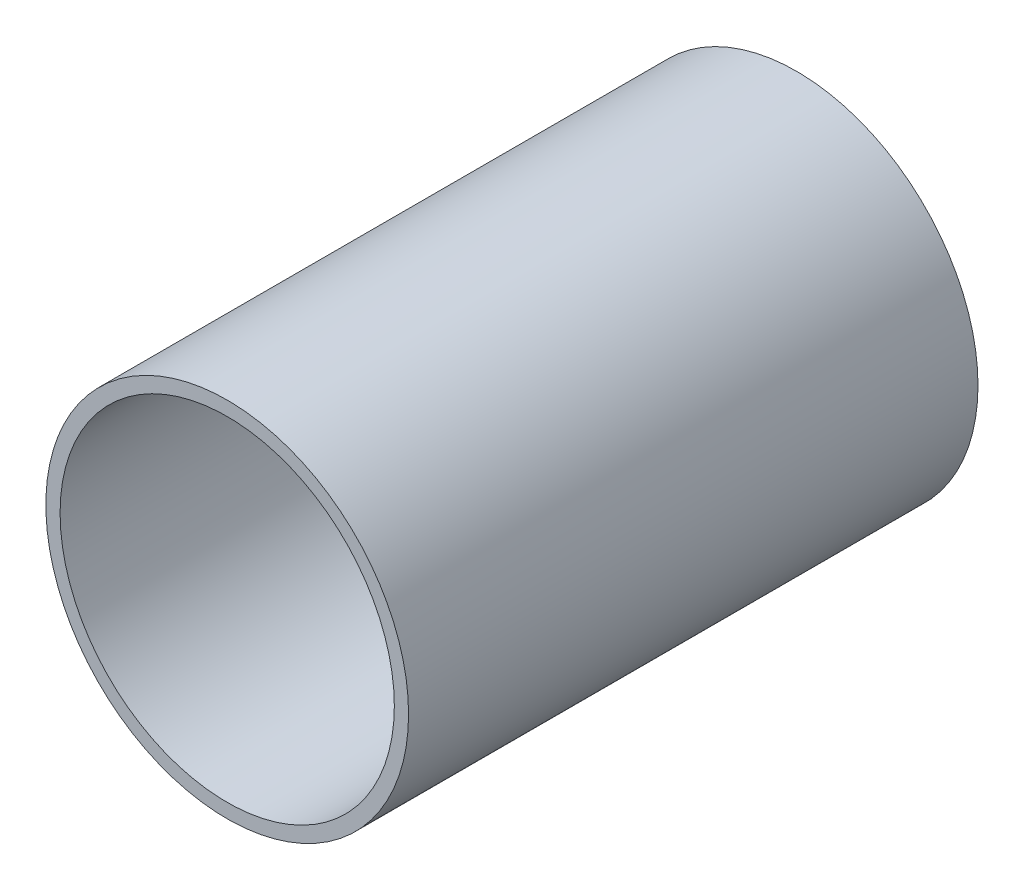
ISO-10303-21;
HEADER;
FILE_DESCRIPTION(('STEP AP214'),'2;1');
FILE_NAME('part.step','',(''),(''),'','','');
FILE_SCHEMA(('AUTOMOTIVE_DESIGN { 1 0 10303 214 1 1 1 1 }'));
ENDSEC;
DATA;
#1=APPLICATION_CONTEXT('core data for automotive mechanical design processes');
#2=APPLICATION_PROTOCOL_DEFINITION('international standard','automotive_design',2000,#1);
#3=PRODUCT_CONTEXT('',#1,'mechanical');
#4=PRODUCT('Part','Part','',(#3));
#5=PRODUCT_RELATED_PRODUCT_CATEGORY('part','',(#4));
#6=PRODUCT_DEFINITION_FORMATION('','',#4);
#7=PRODUCT_DEFINITION_CONTEXT('part definition',#1,'design');
#8=PRODUCT_DEFINITION('design','',#6,#7);
#9=PRODUCT_DEFINITION_SHAPE('','',#8);
#10=(LENGTH_UNIT() NAMED_UNIT(*) SI_UNIT(.MILLI.,.METRE.));
#11=(NAMED_UNIT(*) PLANE_ANGLE_UNIT() SI_UNIT($,.RADIAN.));
#12=(NAMED_UNIT(*) SI_UNIT($,.STERADIAN.) SOLID_ANGLE_UNIT());
#13=UNCERTAINTY_MEASURE_WITH_UNIT(LENGTH_MEASURE(1.E-05),#10,'distance_accuracy_value','');
#14=(GEOMETRIC_REPRESENTATION_CONTEXT(3) GLOBAL_UNCERTAINTY_ASSIGNED_CONTEXT((#13)) GLOBAL_UNIT_ASSIGNED_CONTEXT((#10,
#11,#12)) REPRESENTATION_CONTEXT('',''));
#15=CARTESIAN_POINT('',(0.,0.,0.));
#16=DIRECTION('',(0.,0.,1.));
#17=DIRECTION('',(1.,0.,0.));
#18=AXIS2_PLACEMENT_3D('',#15,#16,#17);
#19=CARTESIAN_POINT('',(0.,0.,10.));
#20=DIRECTION('',(0.,0.,1.));
#21=DIRECTION('',(1.,0.,0.));
#22=AXIS2_PLACEMENT_3D('',#19,#20,#21);
#23=PLANE('',#22);
#24=CARTESIAN_POINT('',(0.,0.,10.));
#25=DIRECTION('',(0.,0.,1.));
#26=DIRECTION('',(1.,0.,0.));
#27=AXIS2_PLACEMENT_3D('',#24,#25,#26);
#28=CIRCLE('',#27,3.18499999999999);
#29=CARTESIAN_POINT('',(3.18499999999999,0.,10.));
#30=VERTEX_POINT('',#29);
#31=EDGE_CURVE('E52',#30,#30,#28,.T.);
#32=ORIENTED_EDGE('',*,*,#31,.T.);
#33=EDGE_LOOP('',(#32));
#34=FACE_BOUND('',#33,.T.);
#35=CARTESIAN_POINT('',(0.,0.,10.));
#36=DIRECTION('',(0.,0.,1.));
#37=DIRECTION('',(1.,0.,0.));
#38=AXIS2_PLACEMENT_3D('',#35,#36,#37);
#39=CIRCLE('',#38,2.93499999999999);
#40=CARTESIAN_POINT('',(2.93499999999999,0.,10.));
#41=VERTEX_POINT('',#40);
#42=EDGE_CURVE('E63',#41,#41,#39,.T.);
#43=ORIENTED_EDGE('',*,*,#42,.F.);
#44=EDGE_LOOP('',(#43));
#45=FACE_BOUND('',#44,.T.);
#46=ADVANCED_FACE('F44',(#34,#45),#23,.T.);
#47=CARTESIAN_POINT('',(0.,0.,0.));
#48=DIRECTION('',(0.,0.,1.));
#49=DIRECTION('',(1.,0.,0.));
#50=AXIS2_PLACEMENT_3D('',#47,#48,#49);
#51=PLANE('',#50);
#52=CARTESIAN_POINT('',(0.,0.,0.));
#53=DIRECTION('',(0.,0.,1.));
#54=DIRECTION('',(1.,0.,0.));
#55=AXIS2_PLACEMENT_3D('',#52,#53,#54);
#56=CIRCLE('',#55,3.18499999999999);
#57=CARTESIAN_POINT('',(3.18499999999999,0.,0.));
#58=VERTEX_POINT('',#57);
#59=EDGE_CURVE('E57',#58,#58,#56,.T.);
#60=ORIENTED_EDGE('',*,*,#59,.F.);
#61=EDGE_LOOP('',(#60));
#62=FACE_BOUND('',#61,.T.);
#63=ADVANCED_FACE('F72',(#62),#51,.F.);
#64=CARTESIAN_POINT('',(0.,0.,10.));
#65=DIRECTION('',(0.,0.,-1.));
#66=DIRECTION('',(-1.,0.,0.));
#67=AXIS2_PLACEMENT_3D('',#64,#65,#66);
#68=CYLINDRICAL_SURFACE('',#67,3.18499999999999);
#69=ORIENTED_EDGE('',*,*,#31,.F.);
#70=EDGE_LOOP('',(#69));
#71=FACE_BOUND('',#70,.T.);
#72=ORIENTED_EDGE('',*,*,#59,.T.);
#73=EDGE_LOOP('',(#72));
#74=FACE_BOUND('',#73,.T.);
#75=ADVANCED_FACE('F46',(#71,#74),#68,.T.);
#76=CARTESIAN_POINT('',(0.,0.,10.));
#77=DIRECTION('',(0.,0.,-1.));
#78=DIRECTION('',(-1.,0.,0.));
#79=AXIS2_PLACEMENT_3D('',#76,#77,#78);
#80=CYLINDRICAL_SURFACE('',#79,2.93499999999999);
#81=CARTESIAN_POINT('',(0.,0.,0.5));
#82=DIRECTION('',(0.,0.,1.));
#83=DIRECTION('',(1.,0.,0.));
#84=AXIS2_PLACEMENT_3D('',#81,#82,#83);
#85=CIRCLE('',#84,2.93499999999999);
#86=CARTESIAN_POINT('',(2.93499999999999,0.,0.5));
#87=VERTEX_POINT('',#86);
#88=EDGE_CURVE('E11',#87,#87,#85,.T.);
#89=ORIENTED_EDGE('',*,*,#88,.F.);
#90=EDGE_LOOP('',(#89));
#91=FACE_BOUND('',#90,.T.);
#92=ORIENTED_EDGE('',*,*,#42,.T.);
#93=EDGE_LOOP('',(#92));
#94=FACE_BOUND('',#93,.T.);
#95=ADVANCED_FACE('F69',(#91,#94),#80,.F.);
#96=CARTESIAN_POINT('',(0.,0.,0.5));
#97=DIRECTION('',(0.,0.,1.));
#98=DIRECTION('',(1.,0.,0.));
#99=AXIS2_PLACEMENT_3D('',#96,#97,#98);
#100=PLANE('',#99);
#101=ORIENTED_EDGE('',*,*,#88,.T.);
#102=EDGE_LOOP('',(#101));
#103=FACE_BOUND('',#102,.T.);
#104=ADVANCED_FACE('F81',(#103),#100,.T.);
#105=CLOSED_SHELL('',(#46,#63,#75,#95,#104));
#106=MANIFOLD_SOLID_BREP('B2',#105);
#107=ADVANCED_BREP_SHAPE_REPRESENTATION('',(#18,#106),#14);
#108=SHAPE_DEFINITION_REPRESENTATION(#9,#107);
ENDSEC;
END-ISO-10303-21;
